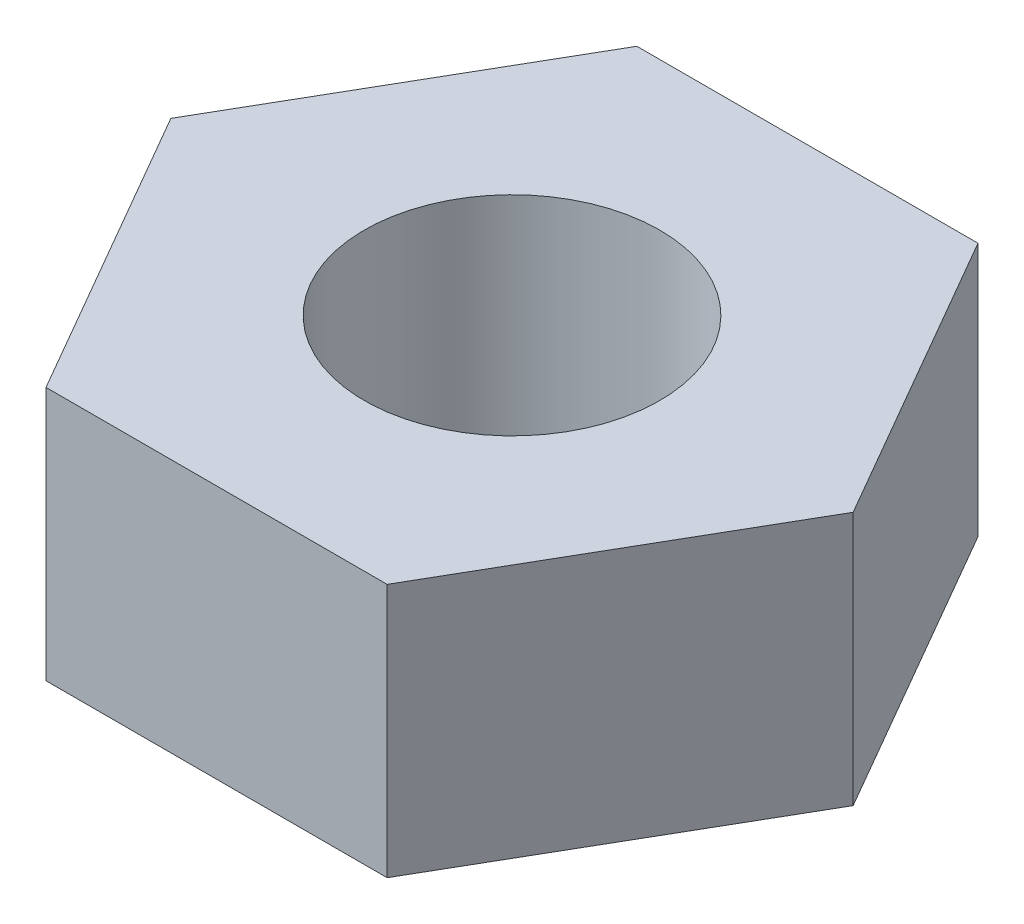
ISO-10303-21;
HEADER;
FILE_DESCRIPTION(('STEP AP214'),'2;1');
FILE_NAME('part.step','',(''),(''),'','','');
FILE_SCHEMA(('AUTOMOTIVE_DESIGN { 1 0 10303 214 1 1 1 1 }'));
ENDSEC;
DATA;
#1=APPLICATION_CONTEXT('core data for automotive mechanical design processes');
#2=APPLICATION_PROTOCOL_DEFINITION('international standard','automotive_design',2000,#1);
#3=PRODUCT_CONTEXT('',#1,'mechanical');
#4=PRODUCT('Part','Part','',(#3));
#5=PRODUCT_RELATED_PRODUCT_CATEGORY('part','',(#4));
#6=PRODUCT_DEFINITION_FORMATION('','',#4);
#7=PRODUCT_DEFINITION_CONTEXT('part definition',#1,'design');
#8=PRODUCT_DEFINITION('design','',#6,#7);
#9=PRODUCT_DEFINITION_SHAPE('','',#8);
#10=(LENGTH_UNIT() NAMED_UNIT(*) SI_UNIT(.MILLI.,.METRE.));
#11=(NAMED_UNIT(*) PLANE_ANGLE_UNIT() SI_UNIT($,.RADIAN.));
#12=(NAMED_UNIT(*) SI_UNIT($,.STERADIAN.) SOLID_ANGLE_UNIT());
#13=UNCERTAINTY_MEASURE_WITH_UNIT(LENGTH_MEASURE(1.E-05),#10,'distance_accuracy_value','');
#14=(GEOMETRIC_REPRESENTATION_CONTEXT(3) GLOBAL_UNCERTAINTY_ASSIGNED_CONTEXT((#13)) GLOBAL_UNIT_ASSIGNED_CONTEXT((#10,
#11,#12)) REPRESENTATION_CONTEXT('',''));
#15=CARTESIAN_POINT('',(0.,0.,0.));
#16=DIRECTION('',(0.,0.,1.));
#17=DIRECTION('',(1.,0.,0.));
#18=AXIS2_PLACEMENT_3D('',#15,#16,#17);
#19=CARTESIAN_POINT('',(0.,2.15,0.));
#20=DIRECTION('',(0.,1.,0.));
#21=DIRECTION('',(0.,0.,1.));
#22=AXIS2_PLACEMENT_3D('',#19,#20,#21);
#23=PLANE('',#22);
#24=DIRECTION('',(-0.5,0.,-0.866025403784438));
#25=VECTOR('',#24,1.);
#26=CARTESIAN_POINT('',(2.88675134594813,2.15,0.));
#27=LINE('',#26,#25);
#28=CARTESIAN_POINT('',(2.88675134594813,2.15,0.));
#29=VERTEX_POINT('',#28);
#30=CARTESIAN_POINT('',(1.44337567297406,2.15,-2.5));
#31=VERTEX_POINT('',#30);
#32=EDGE_CURVE('E146',#29,#31,#27,.T.);
#33=ORIENTED_EDGE('',*,*,#32,.T.);
#34=DIRECTION('',(-1.,0.,0.));
#35=VECTOR('',#34,1.);
#36=CARTESIAN_POINT('',(1.44337567297406,2.15,-2.5));
#37=LINE('',#36,#35);
#38=CARTESIAN_POINT('',(-1.44337567297406,2.15,-2.5));
#39=VERTEX_POINT('',#38);
#40=EDGE_CURVE('E94',#31,#39,#37,.T.);
#41=ORIENTED_EDGE('',*,*,#40,.T.);
#42=DIRECTION('',(-0.5,0.,0.866025403784439));
#43=VECTOR('',#42,1.);
#44=CARTESIAN_POINT('',(-1.44337567297406,2.15,-2.5));
#45=LINE('',#44,#43);
#46=CARTESIAN_POINT('',(-2.88675134594813,2.15,0.));
#47=VERTEX_POINT('',#46);
#48=EDGE_CURVE('E107',#39,#47,#45,.T.);
#49=ORIENTED_EDGE('',*,*,#48,.T.);
#50=DIRECTION('',(0.5,0.,0.866025403784438));
#51=VECTOR('',#50,1.);
#52=CARTESIAN_POINT('',(-2.88675134594813,2.15,0.));
#53=LINE('',#52,#51);
#54=CARTESIAN_POINT('',(-1.44337567297406,2.15,2.5));
#55=VERTEX_POINT('',#54);
#56=EDGE_CURVE('E101',#47,#55,#53,.T.);
#57=ORIENTED_EDGE('',*,*,#56,.T.);
#58=DIRECTION('',(1.,0.,0.));
#59=VECTOR('',#58,1.);
#60=CARTESIAN_POINT('',(-1.44337567297406,2.15,2.5));
#61=LINE('',#60,#59);
#62=CARTESIAN_POINT('',(1.44337567297406,2.15,2.5));
#63=VERTEX_POINT('',#62);
#64=EDGE_CURVE('E105',#55,#63,#61,.T.);
#65=ORIENTED_EDGE('',*,*,#64,.T.);
#66=DIRECTION('',(0.5,0.,-0.866025403784439));
#67=VECTOR('',#66,1.);
#68=CARTESIAN_POINT('',(1.44337567297406,2.15,2.5));
#69=LINE('',#68,#67);
#70=EDGE_CURVE('E57',#63,#29,#69,.T.);
#71=ORIENTED_EDGE('',*,*,#70,.T.);
#72=EDGE_LOOP('',(#33,#41,#49,#57,#65,#71));
#73=FACE_BOUND('',#72,.T.);
#74=CARTESIAN_POINT('',(0.,2.15,0.));
#75=DIRECTION('',(0.,1.,0.));
#76=DIRECTION('',(0.,0.,1.));
#77=AXIS2_PLACEMENT_3D('',#74,#75,#76);
#78=CIRCLE('',#77,1.25);
#79=CARTESIAN_POINT('',(0.,2.15,-1.25));
#80=VERTEX_POINT('',#79);
#81=EDGE_CURVE('E134',#80,#80,#78,.T.);
#82=ORIENTED_EDGE('',*,*,#81,.F.);
#83=EDGE_LOOP('',(#82));
#84=FACE_BOUND('',#83,.T.);
#85=ADVANCED_FACE('F39',(#73,#84),#23,.T.);
#86=CARTESIAN_POINT('',(0.,0.,0.));
#87=DIRECTION('',(0.,1.,0.));
#88=DIRECTION('',(0.,0.,1.));
#89=AXIS2_PLACEMENT_3D('',#86,#87,#88);
#90=PLANE('',#89);
#91=DIRECTION('',(-0.5,0.,-0.866025403784438));
#92=VECTOR('',#91,1.);
#93=CARTESIAN_POINT('',(2.88675134594813,0.,0.));
#94=LINE('',#93,#92);
#95=CARTESIAN_POINT('',(2.88675134594813,0.,0.));
#96=VERTEX_POINT('',#95);
#97=CARTESIAN_POINT('',(1.44337567297406,0.,-2.5));
#98=VERTEX_POINT('',#97);
#99=EDGE_CURVE('E129',#96,#98,#94,.T.);
#100=ORIENTED_EDGE('',*,*,#99,.F.);
#101=DIRECTION('',(0.5,0.,-0.866025403784439));
#102=VECTOR('',#101,1.);
#103=CARTESIAN_POINT('',(1.44337567297406,0.,2.5));
#104=LINE('',#103,#102);
#105=CARTESIAN_POINT('',(1.44337567297406,0.,2.5));
#106=VERTEX_POINT('',#105);
#107=EDGE_CURVE('E86',#106,#96,#104,.T.);
#108=ORIENTED_EDGE('',*,*,#107,.F.);
#109=DIRECTION('',(1.,0.,0.));
#110=VECTOR('',#109,1.);
#111=CARTESIAN_POINT('',(-1.44337567297406,0.,2.5));
#112=LINE('',#111,#110);
#113=CARTESIAN_POINT('',(-1.44337567297406,0.,2.5));
#114=VERTEX_POINT('',#113);
#115=EDGE_CURVE('E80',#114,#106,#112,.T.);
#116=ORIENTED_EDGE('',*,*,#115,.F.);
#117=DIRECTION('',(0.5,0.,0.866025403784438));
#118=VECTOR('',#117,1.);
#119=CARTESIAN_POINT('',(-2.88675134594813,0.,0.));
#120=LINE('',#119,#118);
#121=CARTESIAN_POINT('',(-2.88675134594813,0.,0.));
#122=VERTEX_POINT('',#121);
#123=EDGE_CURVE('E116',#122,#114,#120,.T.);
#124=ORIENTED_EDGE('',*,*,#123,.F.);
#125=DIRECTION('',(-0.5,0.,0.866025403784439));
#126=VECTOR('',#125,1.);
#127=CARTESIAN_POINT('',(-1.44337567297406,0.,-2.5));
#128=LINE('',#127,#126);
#129=CARTESIAN_POINT('',(-1.44337567297406,0.,-2.5));
#130=VERTEX_POINT('',#129);
#131=EDGE_CURVE('E137',#130,#122,#128,.T.);
#132=ORIENTED_EDGE('',*,*,#131,.F.);
#133=DIRECTION('',(-1.,0.,0.));
#134=VECTOR('',#133,1.);
#135=CARTESIAN_POINT('',(1.44337567297406,0.,-2.5));
#136=LINE('',#135,#134);
#137=EDGE_CURVE('E133',#98,#130,#136,.T.);
#138=ORIENTED_EDGE('',*,*,#137,.F.);
#139=EDGE_LOOP('',(#100,#108,#116,#124,#132,#138));
#140=FACE_BOUND('',#139,.T.);
#141=CARTESIAN_POINT('',(0.,0.,0.));
#142=DIRECTION('',(0.,1.,0.));
#143=DIRECTION('',(0.,0.,1.));
#144=AXIS2_PLACEMENT_3D('',#141,#142,#143);
#145=CIRCLE('',#144,1.25);
#146=CARTESIAN_POINT('',(0.,0.,-1.25));
#147=VERTEX_POINT('',#146);
#148=EDGE_CURVE('E243',#147,#147,#145,.T.);
#149=ORIENTED_EDGE('',*,*,#148,.T.);
#150=EDGE_LOOP('',(#149));
#151=FACE_BOUND('',#150,.T.);
#152=ADVANCED_FACE('F159',(#140,#151),#90,.F.);
#153=CARTESIAN_POINT('',(2.88675134594813,2.15,0.));
#154=DIRECTION('',(-0.866025403784438,0.,0.5));
#155=DIRECTION('',(0.5,0.,0.866025403784439));
#156=AXIS2_PLACEMENT_3D('',#153,#154,#155);
#157=PLANE('',#156);
#158=ORIENTED_EDGE('',*,*,#99,.T.);
#159=DIRECTION('',(0.,-1.,0.));
#160=VECTOR('',#159,1.);
#161=CARTESIAN_POINT('',(1.44337567297406,2.15,-2.5));
#162=LINE('',#161,#160);
#163=EDGE_CURVE('E11',#31,#98,#162,.T.);
#164=ORIENTED_EDGE('',*,*,#163,.F.);
#165=ORIENTED_EDGE('',*,*,#32,.F.);
#166=DIRECTION('',(0.,-1.,0.));
#167=VECTOR('',#166,1.);
#168=CARTESIAN_POINT('',(2.88675134594813,2.15,0.));
#169=LINE('',#168,#167);
#170=EDGE_CURVE('E125',#29,#96,#169,.T.);
#171=ORIENTED_EDGE('',*,*,#170,.T.);
#172=EDGE_LOOP('',(#158,#164,#165,#171));
#173=FACE_BOUND('',#172,.T.);
#174=ADVANCED_FACE('F41',(#173),#157,.F.);
#175=CARTESIAN_POINT('',(1.44337567297406,2.15,-2.5));
#176=DIRECTION('',(0.,0.,1.));
#177=DIRECTION('',(1.,0.,0.));
#178=AXIS2_PLACEMENT_3D('',#175,#176,#177);
#179=PLANE('',#178);
#180=ORIENTED_EDGE('',*,*,#137,.T.);
#181=DIRECTION('',(0.,-1.,0.));
#182=VECTOR('',#181,1.);
#183=CARTESIAN_POINT('',(-1.44337567297406,2.15,-2.5));
#184=LINE('',#183,#182);
#185=EDGE_CURVE('E49',#39,#130,#184,.T.);
#186=ORIENTED_EDGE('',*,*,#185,.F.);
#187=ORIENTED_EDGE('',*,*,#40,.F.);
#188=ORIENTED_EDGE('',*,*,#163,.T.);
#189=EDGE_LOOP('',(#180,#186,#187,#188));
#190=FACE_BOUND('',#189,.T.);
#191=ADVANCED_FACE('F184',(#190),#179,.F.);
#192=CARTESIAN_POINT('',(-1.44337567297406,2.15,-2.5));
#193=DIRECTION('',(0.866025403784439,0.,0.5));
#194=DIRECTION('',(0.5,0.,-0.866025403784439));
#195=AXIS2_PLACEMENT_3D('',#192,#193,#194);
#196=PLANE('',#195);
#197=ORIENTED_EDGE('',*,*,#131,.T.);
#198=DIRECTION('',(0.,-1.,0.));
#199=VECTOR('',#198,1.);
#200=CARTESIAN_POINT('',(-2.88675134594813,2.15,0.));
#201=LINE('',#200,#199);
#202=EDGE_CURVE('E118',#47,#122,#201,.T.);
#203=ORIENTED_EDGE('',*,*,#202,.F.);
#204=ORIENTED_EDGE('',*,*,#48,.F.);
#205=ORIENTED_EDGE('',*,*,#185,.T.);
#206=EDGE_LOOP('',(#197,#203,#204,#205));
#207=FACE_BOUND('',#206,.T.);
#208=ADVANCED_FACE('F156',(#207),#196,.F.);
#209=CARTESIAN_POINT('',(-2.88675134594813,2.15,0.));
#210=DIRECTION('',(0.866025403784438,0.,-0.5));
#211=DIRECTION('',(-0.5,0.,-0.866025403784439));
#212=AXIS2_PLACEMENT_3D('',#209,#210,#211);
#213=PLANE('',#212);
#214=ORIENTED_EDGE('',*,*,#123,.T.);
#215=DIRECTION('',(0.,-1.,0.));
#216=VECTOR('',#215,1.);
#217=CARTESIAN_POINT('',(-1.44337567297406,2.15,2.5));
#218=LINE('',#217,#216);
#219=EDGE_CURVE('E113',#55,#114,#218,.T.);
#220=ORIENTED_EDGE('',*,*,#219,.F.);
#221=ORIENTED_EDGE('',*,*,#56,.F.);
#222=ORIENTED_EDGE('',*,*,#202,.T.);
#223=EDGE_LOOP('',(#214,#220,#221,#222));
#224=FACE_BOUND('',#223,.T.);
#225=ADVANCED_FACE('F114',(#224),#213,.F.);
#226=CARTESIAN_POINT('',(-1.44337567297406,2.15,2.5));
#227=DIRECTION('',(0.,0.,-1.));
#228=DIRECTION('',(-1.,0.,0.));
#229=AXIS2_PLACEMENT_3D('',#226,#227,#228);
#230=PLANE('',#229);
#231=ORIENTED_EDGE('',*,*,#115,.T.);
#232=DIRECTION('',(0.,-1.,0.));
#233=VECTOR('',#232,1.);
#234=CARTESIAN_POINT('',(1.44337567297406,2.15,2.5));
#235=LINE('',#234,#233);
#236=EDGE_CURVE('E119',#63,#106,#235,.T.);
#237=ORIENTED_EDGE('',*,*,#236,.F.);
#238=ORIENTED_EDGE('',*,*,#64,.F.);
#239=ORIENTED_EDGE('',*,*,#219,.T.);
#240=EDGE_LOOP('',(#231,#237,#238,#239));
#241=FACE_BOUND('',#240,.T.);
#242=ADVANCED_FACE('F121',(#241),#230,.F.);
#243=CARTESIAN_POINT('',(1.44337567297406,2.15,2.5));
#244=DIRECTION('',(-0.866025403784439,0.,-0.5));
#245=DIRECTION('',(-0.5,0.,0.866025403784439));
#246=AXIS2_PLACEMENT_3D('',#243,#244,#245);
#247=PLANE('',#246);
#248=ORIENTED_EDGE('',*,*,#107,.T.);
#249=ORIENTED_EDGE('',*,*,#170,.F.);
#250=ORIENTED_EDGE('',*,*,#70,.F.);
#251=ORIENTED_EDGE('',*,*,#236,.T.);
#252=EDGE_LOOP('',(#248,#249,#250,#251));
#253=FACE_BOUND('',#252,.T.);
#254=ADVANCED_FACE('F164',(#253),#247,.F.);
#255=CARTESIAN_POINT('',(0.,2.15,0.));
#256=DIRECTION('',(0.,-1.,0.));
#257=DIRECTION('',(0.,0.,-1.));
#258=AXIS2_PLACEMENT_3D('',#255,#256,#257);
#259=CYLINDRICAL_SURFACE('',#258,1.25);
#260=CARTESIAN_POINT('',(0.,2.15,-1.25));
#261=CARTESIAN_POINT('',(0.,2.12760416666667,-1.25));
#262=CARTESIAN_POINT('',(0.,2.10520833333333,-1.25));
#263=CARTESIAN_POINT('',(0.,2.06041666666667,-1.25));
#264=CARTESIAN_POINT('',(0.,2.03802083333333,-1.25));
#265=CARTESIAN_POINT('',(0.,1.99322916666667,-1.25));
#266=CARTESIAN_POINT('',(0.,1.97083333333333,-1.25));
#267=CARTESIAN_POINT('',(0.,1.92604166666667,-1.25));
#268=CARTESIAN_POINT('',(0.,1.90364583333333,-1.25));
#269=CARTESIAN_POINT('',(0.,1.85885416666667,-1.25));
#270=CARTESIAN_POINT('',(0.,1.83645833333333,-1.25));
#271=CARTESIAN_POINT('',(0.,1.79166666666667,-1.25));
#272=CARTESIAN_POINT('',(0.,1.76927083333333,-1.25));
#273=CARTESIAN_POINT('',(0.,1.72447916666667,-1.25));
#274=CARTESIAN_POINT('',(0.,1.70208333333333,-1.25));
#275=CARTESIAN_POINT('',(0.,1.65729166666667,-1.25));
#276=CARTESIAN_POINT('',(0.,1.63489583333333,-1.25));
#277=CARTESIAN_POINT('',(0.,1.59010416666667,-1.25));
#278=CARTESIAN_POINT('',(0.,1.56770833333333,-1.25));
#279=CARTESIAN_POINT('',(0.,1.52291666666667,-1.25));
#280=CARTESIAN_POINT('',(0.,1.50052083333333,-1.25));
#281=CARTESIAN_POINT('',(0.,1.45572916666667,-1.25));
#282=CARTESIAN_POINT('',(0.,1.43333333333333,-1.25));
#283=CARTESIAN_POINT('',(0.,1.38854166666667,-1.25));
#284=CARTESIAN_POINT('',(0.,1.36614583333333,-1.25));
#285=CARTESIAN_POINT('',(0.,1.32135416666667,-1.25));
#286=CARTESIAN_POINT('',(0.,1.29895833333333,-1.25));
#287=CARTESIAN_POINT('',(0.,1.25416666666667,-1.25));
#288=CARTESIAN_POINT('',(0.,1.23177083333333,-1.25));
#289=CARTESIAN_POINT('',(0.,1.18697916666667,-1.25));
#290=CARTESIAN_POINT('',(0.,1.16458333333333,-1.25));
#291=CARTESIAN_POINT('',(0.,1.11979166666667,-1.25));
#292=CARTESIAN_POINT('',(0.,1.09739583333333,-1.25));
#293=CARTESIAN_POINT('',(0.,1.05260416666667,-1.25));
#294=CARTESIAN_POINT('',(0.,1.03020833333333,-1.25));
#295=CARTESIAN_POINT('',(0.,0.985416666666667,-1.25));
#296=CARTESIAN_POINT('',(0.,0.963020833333333,-1.25));
#297=CARTESIAN_POINT('',(0.,0.918229166666666,-1.25));
#298=CARTESIAN_POINT('',(0.,0.895833333333333,-1.25));
#299=CARTESIAN_POINT('',(0.,0.851041666666666,-1.25));
#300=CARTESIAN_POINT('',(0.,0.828645833333333,-1.25));
#301=CARTESIAN_POINT('',(0.,0.783854166666666,-1.25));
#302=CARTESIAN_POINT('',(0.,0.761458333333333,-1.25));
#303=CARTESIAN_POINT('',(0.,0.716666666666666,-1.25));
#304=CARTESIAN_POINT('',(0.,0.694270833333333,-1.25));
#305=CARTESIAN_POINT('',(0.,0.649479166666666,-1.25));
#306=CARTESIAN_POINT('',(0.,0.627083333333333,-1.25));
#307=CARTESIAN_POINT('',(0.,0.582291666666666,-1.25));
#308=CARTESIAN_POINT('',(0.,0.559895833333333,-1.25));
#309=CARTESIAN_POINT('',(0.,0.515104166666666,-1.25));
#310=CARTESIAN_POINT('',(0.,0.492708333333333,-1.25));
#311=CARTESIAN_POINT('',(0.,0.447916666666666,-1.25));
#312=CARTESIAN_POINT('',(0.,0.425520833333333,-1.25));
#313=CARTESIAN_POINT('',(0.,0.380729166666666,-1.25));
#314=CARTESIAN_POINT('',(0.,0.358333333333333,-1.25));
#315=CARTESIAN_POINT('',(0.,0.313541666666666,-1.25));
#316=CARTESIAN_POINT('',(0.,0.291145833333333,-1.25));
#317=CARTESIAN_POINT('',(0.,0.246354166666666,-1.25));
#318=CARTESIAN_POINT('',(0.,0.223958333333333,-1.25));
#319=CARTESIAN_POINT('',(0.,0.179166666666666,-1.25));
#320=CARTESIAN_POINT('',(0.,0.156770833333333,-1.25));
#321=CARTESIAN_POINT('',(0.,0.111979166666666,-1.25));
#322=CARTESIAN_POINT('',(0.,0.0895833333333329,-1.25));
#323=CARTESIAN_POINT('',(0.,0.0447916666666662,-1.25));
#324=CARTESIAN_POINT('',(0.,0.0223958333333329,-1.25));
#325=CARTESIAN_POINT('',(0.,0.,-1.25));
#326=B_SPLINE_CURVE_WITH_KNOTS('',3,(#260,#261,#262,#263,#264,#265,#266,#267,#268,#269,#270,
#271,#272,#273,#274,#275,#276,#277,#278,#279,#280,#281,#282,#283,#284,#285,#286,#287,#288,#289,
#290,#291,#292,#293,#294,#295,#296,#297,#298,#299,#300,#301,#302,#303,#304,#305,#306,#307,#308,
#309,#310,#311,#312,#313,#314,#315,#316,#317,#318,#319,#320,#321,#322,#323,#324,#325),
.UNSPECIFIED.,.F.,.F.,(4,2,2,2,2,2,2,2,2,2,2,2,2,2,2,2,2,2,2,2,2,2,2,2,2,2,2,2,2,2,2,2,4),(0.,
0.0671875,0.134375,0.2015625,0.26875,0.3359375,0.403125,0.4703125,0.5375,0.6046875,0.671875,
0.7390625,0.80625,0.8734375,0.940625,1.0078125,1.075,1.1421875,1.209375,1.2765625,1.34375,
1.4109375,1.478125,1.5453125,1.6125,1.6796875,1.746875,1.8140625,1.88125,1.9484375,2.015625,
2.0828125,2.15),.UNSPECIFIED.);
#327=EDGE_CURVE('BSEAM166',#80,#147,#326,.T.);
#328=ORIENTED_EDGE('',*,*,#81,.T.);
#329=ORIENTED_EDGE('',*,*,#148,.F.);
#330=ORIENTED_EDGE('',*,*,#327,.T.);
#331=ORIENTED_EDGE('',*,*,#327,.F.);
#332=EDGE_LOOP('',(#328,#330,#329,#331));
#333=FACE_BOUND('',#332,.T.);
#334=ADVANCED_FACE('F166',(#333),#259,.F.);
#335=CLOSED_SHELL('',(#85,#152,#174,#191,#208,#225,#242,#254,#334));
#336=MANIFOLD_SOLID_BREP('B2',#335);
#337=ADVANCED_BREP_SHAPE_REPRESENTATION('',(#18,#336),#14);
#338=SHAPE_DEFINITION_REPRESENTATION(#9,#337);
ENDSEC;
END-ISO-10303-21;
